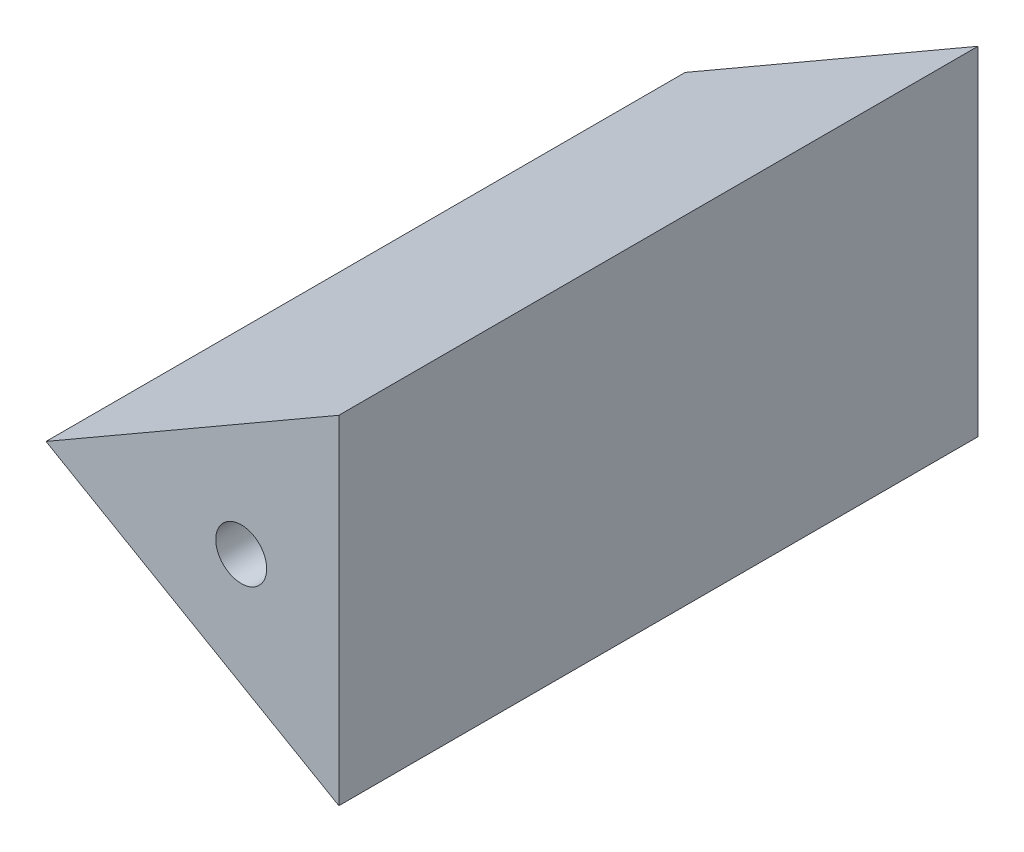
ISO-10303-21;
HEADER;
FILE_DESCRIPTION(('STEP AP214'),'2;1');
FILE_NAME('part.step','',(''),(''),'','','');
FILE_SCHEMA(('AUTOMOTIVE_DESIGN { 1 0 10303 214 1 1 1 1 }'));
ENDSEC;
DATA;
#1=APPLICATION_CONTEXT('core data for automotive mechanical design processes');
#2=APPLICATION_PROTOCOL_DEFINITION('international standard','automotive_design',2000,#1);
#3=PRODUCT_CONTEXT('',#1,'mechanical');
#4=PRODUCT('Part','Part','',(#3));
#5=PRODUCT_RELATED_PRODUCT_CATEGORY('part','',(#4));
#6=PRODUCT_DEFINITION_FORMATION('','',#4);
#7=PRODUCT_DEFINITION_CONTEXT('part definition',#1,'design');
#8=PRODUCT_DEFINITION('design','',#6,#7);
#9=PRODUCT_DEFINITION_SHAPE('','',#8);
#10=(LENGTH_UNIT() NAMED_UNIT(*) SI_UNIT(.MILLI.,.METRE.));
#11=(NAMED_UNIT(*) PLANE_ANGLE_UNIT() SI_UNIT($,.RADIAN.));
#12=(NAMED_UNIT(*) SI_UNIT($,.STERADIAN.) SOLID_ANGLE_UNIT());
#13=UNCERTAINTY_MEASURE_WITH_UNIT(LENGTH_MEASURE(1.E-05),#10,'distance_accuracy_value','');
#14=(GEOMETRIC_REPRESENTATION_CONTEXT(3) GLOBAL_UNCERTAINTY_ASSIGNED_CONTEXT((#13)) GLOBAL_UNIT_ASSIGNED_CONTEXT((#10,
#11,#12)) REPRESENTATION_CONTEXT('',''));
#15=CARTESIAN_POINT('',(0.,0.,0.));
#16=DIRECTION('',(0.,0.,1.));
#17=DIRECTION('',(1.,0.,0.));
#18=AXIS2_PLACEMENT_3D('',#15,#16,#17);
#19=CARTESIAN_POINT('',(15.2729157776003,-26.453466106524,100.));
#20=DIRECTION('',(-1.,0.,0.));
#21=DIRECTION('',(0.,0.,1.));
#22=AXIS2_PLACEMENT_3D('',#19,#20,#21);
#23=PLANE('',#22);
#24=DIRECTION('',(0.,1.,0.));
#25=VECTOR('',#24,1.);
#26=CARTESIAN_POINT('',(15.2729157776003,-26.453466106524,0.));
#27=LINE('',#26,#25);
#28=CARTESIAN_POINT('',(15.2729157776003,-26.453466106524,0.));
#29=VERTEX_POINT('',#28);
#30=CARTESIAN_POINT('',(15.2729157776003,26.453466106524,0.));
#31=VERTEX_POINT('',#30);
#32=EDGE_CURVE('E89',#29,#31,#27,.T.);
#33=ORIENTED_EDGE('',*,*,#32,.T.);
#34=DIRECTION('',(0.,0.,-1.));
#35=VECTOR('',#34,1.);
#36=CARTESIAN_POINT('',(15.2729157776003,26.453466106524,100.));
#37=LINE('',#36,#35);
#38=CARTESIAN_POINT('',(15.2729157776003,26.453466106524,100.));
#39=VERTEX_POINT('',#38);
#40=EDGE_CURVE('E11',#39,#31,#37,.T.);
#41=ORIENTED_EDGE('',*,*,#40,.F.);
#42=DIRECTION('',(0.,1.,0.));
#43=VECTOR('',#42,1.);
#44=CARTESIAN_POINT('',(15.2729157776003,-26.453466106524,100.));
#45=LINE('',#44,#43);
#46=CARTESIAN_POINT('',(15.2729157776003,-26.453466106524,100.));
#47=VERTEX_POINT('',#46);
#48=EDGE_CURVE('E81',#47,#39,#45,.T.);
#49=ORIENTED_EDGE('',*,*,#48,.F.);
#50=DIRECTION('',(0.,0.,-1.));
#51=VECTOR('',#50,1.);
#52=CARTESIAN_POINT('',(15.2729157776003,-26.453466106524,100.));
#53=LINE('',#52,#51);
#54=EDGE_CURVE('E90',#47,#29,#53,.T.);
#55=ORIENTED_EDGE('',*,*,#54,.T.);
#56=EDGE_LOOP('',(#33,#41,#49,#55));
#57=FACE_BOUND('',#56,.T.);
#58=ADVANCED_FACE('F39',(#57),#23,.F.);
#59=CARTESIAN_POINT('',(15.2729157776003,26.453466106524,100.));
#60=DIRECTION('',(0.5,-0.866025403784439,0.));
#61=DIRECTION('',(0.866025403784439,0.5,0.));
#62=AXIS2_PLACEMENT_3D('',#59,#60,#61);
#63=PLANE('',#62);
#64=DIRECTION('',(-0.866025403784439,-0.5,0.));
#65=VECTOR('',#64,1.);
#66=CARTESIAN_POINT('',(15.2729157776003,26.453466106524,0.));
#67=LINE('',#66,#65);
#68=CARTESIAN_POINT('',(-30.5458315552006,0.,0.));
#69=VERTEX_POINT('',#68);
#70=EDGE_CURVE('E68',#31,#69,#67,.T.);
#71=ORIENTED_EDGE('',*,*,#70,.T.);
#72=DIRECTION('',(0.,0.,-1.));
#73=VECTOR('',#72,1.);
#74=CARTESIAN_POINT('',(-30.5458315552006,0.,100.));
#75=LINE('',#74,#73);
#76=CARTESIAN_POINT('',(-30.5458315552006,0.,100.));
#77=VERTEX_POINT('',#76);
#78=EDGE_CURVE('E48',#77,#69,#75,.T.);
#79=ORIENTED_EDGE('',*,*,#78,.F.);
#80=DIRECTION('',(-0.866025403784439,-0.5,0.));
#81=VECTOR('',#80,1.);
#82=CARTESIAN_POINT('',(15.2729157776003,26.453466106524,100.));
#83=LINE('',#82,#81);
#84=EDGE_CURVE('E76',#39,#77,#83,.T.);
#85=ORIENTED_EDGE('',*,*,#84,.F.);
#86=ORIENTED_EDGE('',*,*,#40,.T.);
#87=EDGE_LOOP('',(#71,#79,#85,#86));
#88=FACE_BOUND('',#87,.T.);
#89=ADVANCED_FACE('F77',(#88),#63,.F.);
#90=CARTESIAN_POINT('',(-30.5458315552006,0.,100.));
#91=DIRECTION('',(0.5,0.866025403784439,0.));
#92=DIRECTION('',(-0.866025403784439,0.5,0.));
#93=AXIS2_PLACEMENT_3D('',#90,#91,#92);
#94=PLANE('',#93);
#95=DIRECTION('',(0.866025403784439,-0.5,0.));
#96=VECTOR('',#95,1.);
#97=CARTESIAN_POINT('',(-30.5458315552006,0.,0.));
#98=LINE('',#97,#96);
#99=EDGE_CURVE('E73',#69,#29,#98,.T.);
#100=ORIENTED_EDGE('',*,*,#99,.T.);
#101=ORIENTED_EDGE('',*,*,#54,.F.);
#102=DIRECTION('',(0.866025403784439,-0.5,0.));
#103=VECTOR('',#102,1.);
#104=CARTESIAN_POINT('',(-30.5458315552006,0.,100.));
#105=LINE('',#104,#103);
#106=EDGE_CURVE('E56',#77,#47,#105,.T.);
#107=ORIENTED_EDGE('',*,*,#106,.F.);
#108=ORIENTED_EDGE('',*,*,#78,.T.);
#109=EDGE_LOOP('',(#100,#101,#107,#108));
#110=FACE_BOUND('',#109,.T.);
#111=ADVANCED_FACE('F107',(#110),#94,.F.);
#112=CARTESIAN_POINT('',(0.,0.,100.));
#113=DIRECTION('',(0.,0.,1.));
#114=DIRECTION('',(1.,0.,0.));
#115=AXIS2_PLACEMENT_3D('',#112,#113,#114);
#116=PLANE('',#115);
#117=CARTESIAN_POINT('',(0.,0.,100.));
#118=DIRECTION('',(0.,0.,1.));
#119=DIRECTION('',(1.,0.,0.));
#120=AXIS2_PLACEMENT_3D('',#117,#118,#119);
#121=CIRCLE('',#120,3.98214934216887);
#122=CARTESIAN_POINT('',(3.98214934216887,0.,100.));
#123=VERTEX_POINT('',#122);
#124=EDGE_CURVE('E99',#123,#123,#121,.T.);
#125=ORIENTED_EDGE('',*,*,#124,.F.);
#126=EDGE_LOOP('',(#125));
#127=FACE_BOUND('',#126,.T.);
#128=ORIENTED_EDGE('',*,*,#48,.T.);
#129=ORIENTED_EDGE('',*,*,#84,.T.);
#130=ORIENTED_EDGE('',*,*,#106,.T.);
#131=EDGE_LOOP('',(#128,#129,#130));
#132=FACE_BOUND('',#131,.T.);
#133=ADVANCED_FACE('F84',(#127,#132),#116,.T.);
#134=CARTESIAN_POINT('',(0.,0.,0.));
#135=DIRECTION('',(0.,0.,1.));
#136=DIRECTION('',(1.,0.,0.));
#137=AXIS2_PLACEMENT_3D('',#134,#135,#136);
#138=PLANE('',#137);
#139=CARTESIAN_POINT('',(0.,0.,0.));
#140=DIRECTION('',(0.,0.,1.));
#141=DIRECTION('',(1.,0.,0.));
#142=AXIS2_PLACEMENT_3D('',#139,#140,#141);
#143=CIRCLE('',#142,3.98214934216887);
#144=CARTESIAN_POINT('',(3.98214934216887,0.,0.));
#145=VERTEX_POINT('',#144);
#146=EDGE_CURVE('E93',#145,#145,#143,.T.);
#147=ORIENTED_EDGE('',*,*,#146,.T.);
#148=EDGE_LOOP('',(#147));
#149=FACE_BOUND('',#148,.T.);
#150=ORIENTED_EDGE('',*,*,#32,.F.);
#151=ORIENTED_EDGE('',*,*,#99,.F.);
#152=ORIENTED_EDGE('',*,*,#70,.F.);
#153=EDGE_LOOP('',(#150,#151,#152));
#154=FACE_BOUND('',#153,.T.);
#155=ADVANCED_FACE('F108',(#149,#154),#138,.F.);
#156=CARTESIAN_POINT('',(0.,0.,0.));
#157=DIRECTION('',(0.,0.,1.));
#158=DIRECTION('',(1.,0.,0.));
#159=AXIS2_PLACEMENT_3D('',#156,#157,#158);
#160=CYLINDRICAL_SURFACE('',#159,3.98214934216887);
#161=ORIENTED_EDGE('',*,*,#146,.F.);
#162=EDGE_LOOP('',(#161));
#163=FACE_BOUND('',#162,.T.);
#164=ORIENTED_EDGE('',*,*,#124,.T.);
#165=EDGE_LOOP('',(#164));
#166=FACE_BOUND('',#165,.T.);
#167=ADVANCED_FACE('F110',(#163,#166),#160,.F.);
#168=CLOSED_SHELL('',(#58,#89,#111,#133,#155,#167));
#169=MANIFOLD_SOLID_BREP('B2',#168);
#170=ADVANCED_BREP_SHAPE_REPRESENTATION('',(#18,#169),#14);
#171=SHAPE_DEFINITION_REPRESENTATION(#9,#170);
ENDSEC;
END-ISO-10303-21;
